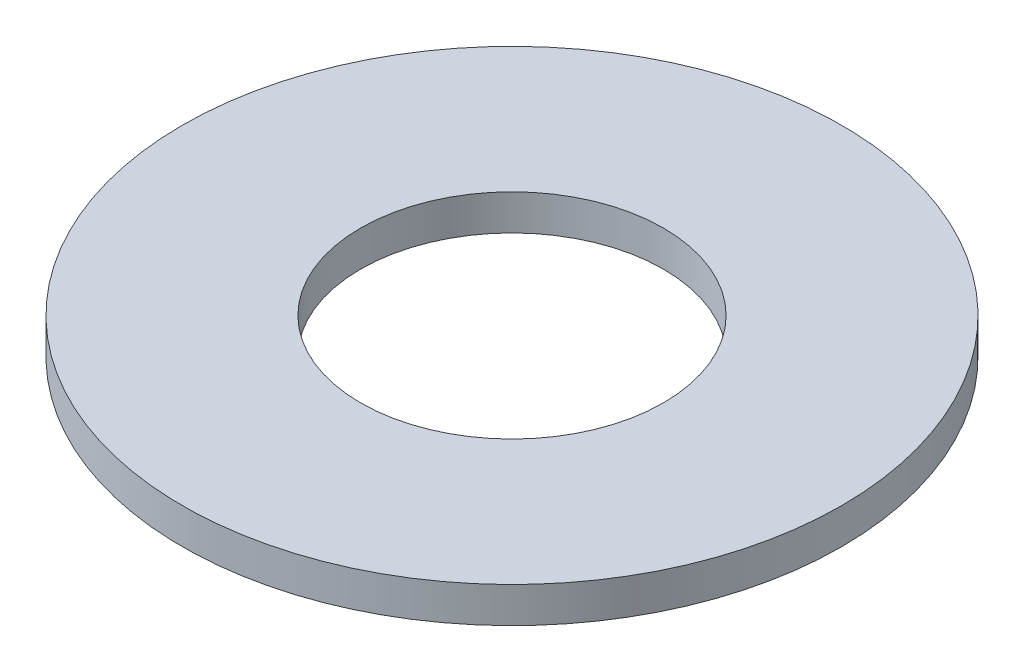
ISO-10303-21;
HEADER;
FILE_DESCRIPTION(('STEP AP214'),'2;1');
FILE_NAME('part.step','',(''),(''),'','','');
FILE_SCHEMA(('AUTOMOTIVE_DESIGN { 1 0 10303 214 1 1 1 1 }'));
ENDSEC;
DATA;
#1=APPLICATION_CONTEXT('core data for automotive mechanical design processes');
#2=APPLICATION_PROTOCOL_DEFINITION('international standard','automotive_design',2000,#1);
#3=PRODUCT_CONTEXT('',#1,'mechanical');
#4=PRODUCT('Part','Part','',(#3));
#5=PRODUCT_RELATED_PRODUCT_CATEGORY('part','',(#4));
#6=PRODUCT_DEFINITION_FORMATION('','',#4);
#7=PRODUCT_DEFINITION_CONTEXT('part definition',#1,'design');
#8=PRODUCT_DEFINITION('design','',#6,#7);
#9=PRODUCT_DEFINITION_SHAPE('','',#8);
#10=(LENGTH_UNIT() NAMED_UNIT(*) SI_UNIT(.MILLI.,.METRE.));
#11=(NAMED_UNIT(*) PLANE_ANGLE_UNIT() SI_UNIT($,.RADIAN.));
#12=(NAMED_UNIT(*) SI_UNIT($,.STERADIAN.) SOLID_ANGLE_UNIT());
#13=UNCERTAINTY_MEASURE_WITH_UNIT(LENGTH_MEASURE(1.E-05),#10,'distance_accuracy_value','');
#14=(GEOMETRIC_REPRESENTATION_CONTEXT(3) GLOBAL_UNCERTAINTY_ASSIGNED_CONTEXT((#13)) GLOBAL_UNIT_ASSIGNED_CONTEXT((#10,
#11,#12)) REPRESENTATION_CONTEXT('',''));
#15=CARTESIAN_POINT('',(0.,0.,0.));
#16=DIRECTION('',(0.,0.,1.));
#17=DIRECTION('',(1.,0.,0.));
#18=AXIS2_PLACEMENT_3D('',#15,#16,#17);
#19=CARTESIAN_POINT('',(0.,1.,0.));
#20=DIRECTION('',(0.,1.,0.));
#21=DIRECTION('',(0.,0.,1.));
#22=AXIS2_PLACEMENT_3D('',#19,#20,#21);
#23=PLANE('',#22);
#24=CARTESIAN_POINT('',(0.,1.,0.));
#25=DIRECTION('',(0.,1.,0.));
#26=DIRECTION('',(1.,0.,0.));
#27=AXIS2_PLACEMENT_3D('',#24,#25,#26);
#28=CIRCLE('',#27,9.25);
#29=CARTESIAN_POINT('',(9.25,1.,0.));
#30=VERTEX_POINT('',#29);
#31=EDGE_CURVE('E11',#30,#30,#28,.T.);
#32=ORIENTED_EDGE('',*,*,#31,.T.);
#33=EDGE_LOOP('',(#32));
#34=FACE_BOUND('',#33,.T.);
#35=CARTESIAN_POINT('',(0.,1.,0.));
#36=DIRECTION('',(0.,1.,0.));
#37=DIRECTION('',(0.,0.,1.));
#38=AXIS2_PLACEMENT_3D('',#35,#36,#37);
#39=CIRCLE('',#38,4.25);
#40=CARTESIAN_POINT('',(0.,1.,4.25));
#41=VERTEX_POINT('',#40);
#42=EDGE_CURVE('E49',#41,#41,#39,.T.);
#43=ORIENTED_EDGE('',*,*,#42,.F.);
#44=EDGE_LOOP('',(#43));
#45=FACE_BOUND('',#44,.T.);
#46=ADVANCED_FACE('F38',(#34,#45),#23,.T.);
#47=CARTESIAN_POINT('',(0.,0.,0.));
#48=DIRECTION('',(0.,1.,0.));
#49=DIRECTION('',(0.,0.,1.));
#50=AXIS2_PLACEMENT_3D('',#47,#48,#49);
#51=PLANE('',#50);
#52=CARTESIAN_POINT('',(0.,0.,0.));
#53=DIRECTION('',(0.,1.,0.));
#54=DIRECTION('',(1.,0.,0.));
#55=AXIS2_PLACEMENT_3D('',#52,#53,#54);
#56=CIRCLE('',#55,9.25);
#57=CARTESIAN_POINT('',(9.25,0.,0.));
#58=VERTEX_POINT('',#57);
#59=EDGE_CURVE('E42',#58,#58,#56,.T.);
#60=ORIENTED_EDGE('',*,*,#59,.F.);
#61=EDGE_LOOP('',(#60));
#62=FACE_BOUND('',#61,.T.);
#63=CARTESIAN_POINT('',(0.,0.,0.));
#64=DIRECTION('',(0.,1.,0.));
#65=DIRECTION('',(0.,0.,1.));
#66=AXIS2_PLACEMENT_3D('',#63,#64,#65);
#67=CIRCLE('',#66,4.25);
#68=CARTESIAN_POINT('',(0.,0.,4.25));
#69=VERTEX_POINT('',#68);
#70=EDGE_CURVE('E51',#69,#69,#67,.T.);
#71=ORIENTED_EDGE('',*,*,#70,.T.);
#72=EDGE_LOOP('',(#71));
#73=FACE_BOUND('',#72,.T.);
#74=ADVANCED_FACE('F61',(#62,#73),#51,.F.);
#75=CARTESIAN_POINT('',(0.,1.,0.));
#76=DIRECTION('',(0.,-1.,0.));
#77=DIRECTION('',(0.,0.,-1.));
#78=AXIS2_PLACEMENT_3D('',#75,#76,#77);
#79=CYLINDRICAL_SURFACE('',#78,9.25);
#80=ORIENTED_EDGE('',*,*,#31,.F.);
#81=EDGE_LOOP('',(#80));
#82=FACE_BOUND('',#81,.T.);
#83=ORIENTED_EDGE('',*,*,#59,.T.);
#84=EDGE_LOOP('',(#83));
#85=FACE_BOUND('',#84,.T.);
#86=ADVANCED_FACE('F40',(#82,#85),#79,.T.);
#87=CARTESIAN_POINT('',(0.,1.,0.));
#88=DIRECTION('',(0.,-1.,0.));
#89=DIRECTION('',(0.,0.,-1.));
#90=AXIS2_PLACEMENT_3D('',#87,#88,#89);
#91=CYLINDRICAL_SURFACE('',#90,4.25);
#92=ORIENTED_EDGE('',*,*,#42,.T.);
#93=EDGE_LOOP('',(#92));
#94=FACE_BOUND('',#93,.T.);
#95=ORIENTED_EDGE('',*,*,#70,.F.);
#96=EDGE_LOOP('',(#95));
#97=FACE_BOUND('',#96,.T.);
#98=ADVANCED_FACE('F57',(#94,#97),#91,.F.);
#99=CLOSED_SHELL('',(#46,#74,#86,#98));
#100=MANIFOLD_SOLID_BREP('B2',#99);
#101=ADVANCED_BREP_SHAPE_REPRESENTATION('',(#18,#100),#14);
#102=SHAPE_DEFINITION_REPRESENTATION(#9,#101);
ENDSEC;
END-ISO-10303-21;
